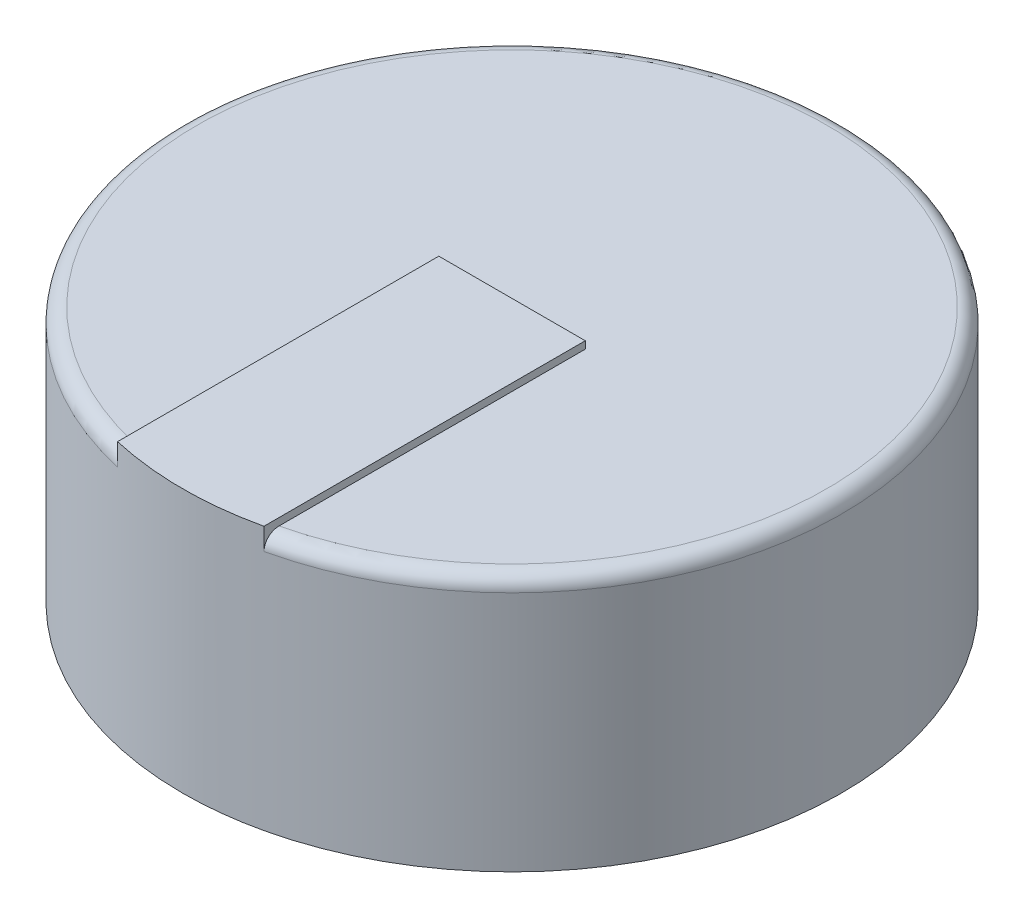
ISO-10303-21;
HEADER;
FILE_DESCRIPTION(('STEP AP214'),'2;1');
FILE_NAME('part.step','',(''),(''),'','','');
FILE_SCHEMA(('AUTOMOTIVE_DESIGN { 1 0 10303 214 1 1 1 1 }'));
ENDSEC;
DATA;
#1=APPLICATION_CONTEXT('core data for automotive mechanical design processes');
#2=APPLICATION_PROTOCOL_DEFINITION('international standard','automotive_design',2000,#1);
#3=PRODUCT_CONTEXT('',#1,'mechanical');
#4=PRODUCT('Part','Part','',(#3));
#5=PRODUCT_RELATED_PRODUCT_CATEGORY('part','',(#4));
#6=PRODUCT_DEFINITION_FORMATION('','',#4);
#7=PRODUCT_DEFINITION_CONTEXT('part definition',#1,'design');
#8=PRODUCT_DEFINITION('design','',#6,#7);
#9=PRODUCT_DEFINITION_SHAPE('','',#8);
#10=(LENGTH_UNIT() NAMED_UNIT(*) SI_UNIT(.MILLI.,.METRE.));
#11=(NAMED_UNIT(*) PLANE_ANGLE_UNIT() SI_UNIT($,.RADIAN.));
#12=(NAMED_UNIT(*) SI_UNIT($,.STERADIAN.) SOLID_ANGLE_UNIT());
#13=UNCERTAINTY_MEASURE_WITH_UNIT(LENGTH_MEASURE(1.E-05),#10,'distance_accuracy_value','');
#14=(GEOMETRIC_REPRESENTATION_CONTEXT(3) GLOBAL_UNCERTAINTY_ASSIGNED_CONTEXT((#13)) GLOBAL_UNIT_ASSIGNED_CONTEXT((#10,
#11,#12)) REPRESENTATION_CONTEXT('',''));
#15=CARTESIAN_POINT('',(0.,0.,0.));
#16=DIRECTION('',(0.,0.,1.));
#17=DIRECTION('',(1.,0.,0.));
#18=AXIS2_PLACEMENT_3D('',#15,#16,#17);
#19=CARTESIAN_POINT('',(0.,4.445,0.));
#20=DIRECTION('',(0.,-1.,0.));
#21=DIRECTION('',(0.,0.,-1.));
#22=AXIS2_PLACEMENT_3D('',#19,#20,#21);
#23=CYLINDRICAL_SURFACE('',#22,5.715);
#24=CARTESIAN_POINT('',(0.,0.,0.));
#25=DIRECTION('',(0.,1.,0.));
#26=DIRECTION('',(0.,0.,1.));
#27=AXIS2_PLACEMENT_3D('',#24,#25,#26);
#28=CIRCLE('',#27,5.715);
#29=CARTESIAN_POINT('',(0.,0.,5.715));
#30=VERTEX_POINT('',#29);
#31=EDGE_CURVE('E123',#30,#30,#28,.T.);
#32=ORIENTED_EDGE('',*,*,#31,.T.);
#33=EDGE_LOOP('',(#32));
#34=FACE_BOUND('',#33,.T.);
#35=CARTESIAN_POINT('',(0.,4.191,0.));
#36=DIRECTION('',(0.,1.,0.));
#37=DIRECTION('',(0.,0.,1.));
#38=AXIS2_PLACEMENT_3D('',#35,#36,#37);
#39=CIRCLE('',#38,5.715);
#40=CARTESIAN_POINT('',(-1.27,4.19099999999924,5.5721023859994));
#41=VERTEX_POINT('',#40);
#42=CARTESIAN_POINT('',(1.27,4.191,5.572102385994));
#43=VERTEX_POINT('',#42);
#44=EDGE_CURVE('E128',#41,#43,#39,.F.);
#45=ORIENTED_EDGE('',*,*,#44,.T.);
#46=DIRECTION('',(0.,-1.,0.));
#47=VECTOR('',#46,1.);
#48=CARTESIAN_POINT('',(1.27,4.572,5.572102385994));
#49=LINE('',#48,#47);
#50=CARTESIAN_POINT('',(1.27,4.572,5.572102385994));
#51=VERTEX_POINT('',#50);
#52=EDGE_CURVE('E93',#51,#43,#49,.T.);
#53=ORIENTED_EDGE('',*,*,#52,.F.);
#54=CARTESIAN_POINT('',(0.,4.572,0.));
#55=DIRECTION('',(0.,-1.,0.));
#56=DIRECTION('',(0.,0.,1.));
#57=AXIS2_PLACEMENT_3D('',#54,#55,#56);
#58=CIRCLE('',#57,5.715);
#59=CARTESIAN_POINT('',(-1.27,4.572,5.572102385994));
#60=VERTEX_POINT('',#59);
#61=EDGE_CURVE('E104',#51,#60,#58,.T.);
#62=ORIENTED_EDGE('',*,*,#61,.T.);
#63=DIRECTION('',(0.,-1.,0.));
#64=VECTOR('',#63,1.);
#65=CARTESIAN_POINT('',(-1.27,4.572,5.572102385994));
#66=LINE('',#65,#64);
#67=EDGE_CURVE('E115',#60,#41,#66,.T.);
#68=ORIENTED_EDGE('',*,*,#67,.T.);
#69=EDGE_LOOP('',(#45,#53,#62,#68));
#70=FACE_BOUND('',#69,.T.);
#71=ADVANCED_FACE('F35',(#34,#70),#23,.T.);
#72=CARTESIAN_POINT('',(0.,4.445,0.));
#73=DIRECTION('',(0.,1.,0.));
#74=DIRECTION('',(0.,0.,1.));
#75=AXIS2_PLACEMENT_3D('',#72,#73,#74);
#76=PLANE('',#75);
#77=DIRECTION('',(0.,0.,1.));
#78=VECTOR('',#77,1.);
#79=CARTESIAN_POINT('',(1.27,4.445,5.715));
#80=LINE('',#79,#78);
#81=CARTESIAN_POINT('',(1.27,4.445,0.));
#82=VERTEX_POINT('',#81);
#83=CARTESIAN_POINT('',(1.27,4.445,5.31127301124693));
#84=VERTEX_POINT('',#83);
#85=EDGE_CURVE('E89',#82,#84,#80,.T.);
#86=ORIENTED_EDGE('',*,*,#85,.T.);
#87=CARTESIAN_POINT('',(0.,4.445,0.));
#88=DIRECTION('',(0.,1.,0.));
#89=DIRECTION('',(0.,0.,1.));
#90=AXIS2_PLACEMENT_3D('',#87,#88,#89);
#91=CIRCLE('',#90,5.461);
#92=CARTESIAN_POINT('',(-1.27,4.445,5.31127301124693));
#93=VERTEX_POINT('',#92);
#94=EDGE_CURVE('E126',#84,#93,#91,.T.);
#95=ORIENTED_EDGE('',*,*,#94,.T.);
#96=DIRECTION('',(0.,0.,-1.));
#97=VECTOR('',#96,1.);
#98=CARTESIAN_POINT('',(-1.27,4.445,0.));
#99=LINE('',#98,#97);
#100=CARTESIAN_POINT('',(-1.27,4.445,0.));
#101=VERTEX_POINT('',#100);
#102=EDGE_CURVE('E114',#93,#101,#99,.T.);
#103=ORIENTED_EDGE('',*,*,#102,.T.);
#104=DIRECTION('',(1.,0.,0.));
#105=VECTOR('',#104,1.);
#106=CARTESIAN_POINT('',(1.27,4.445,0.));
#107=LINE('',#106,#105);
#108=EDGE_CURVE('E120',#101,#82,#107,.T.);
#109=ORIENTED_EDGE('',*,*,#108,.T.);
#110=EDGE_LOOP('',(#86,#95,#103,#109));
#111=FACE_BOUND('',#110,.T.);
#112=ADVANCED_FACE('F136',(#111),#76,.T.);
#113=CARTESIAN_POINT('',(0.,0.,0.));
#114=DIRECTION('',(0.,1.,0.));
#115=DIRECTION('',(0.,0.,1.));
#116=AXIS2_PLACEMENT_3D('',#113,#114,#115);
#117=PLANE('',#116);
#118=ORIENTED_EDGE('',*,*,#31,.F.);
#119=EDGE_LOOP('',(#118));
#120=FACE_BOUND('',#119,.T.);
#121=ADVANCED_FACE('F139',(#120),#117,.F.);
#122=CARTESIAN_POINT('',(0.,4.191,0.));
#123=DIRECTION('',(0.,1.,0.));
#124=DIRECTION('',(0.,0.,1.));
#125=AXIS2_PLACEMENT_3D('',#122,#123,#124);
#126=TOROIDAL_SURFACE('',#125,5.461,0.254);
#127=CARTESIAN_POINT('',(1.27,4.32026832968139,5.08619547771289));
#128=CARTESIAN_POINT('',(1.27,4.3083429714675,5.07892910262781));
#129=CARTESIAN_POINT('',(1.27,4.29580631370099,5.07264950372764));
#130=CARTESIAN_POINT('',(1.27,4.26985002626806,5.06227218953751));
#131=CARTESIAN_POINT('',(1.27,4.256429621953,5.05817641787207));
#132=CARTESIAN_POINT('',(1.27,4.22908515977283,5.05230835180071));
#133=CARTESIAN_POINT('',(1.27,4.21516099292922,5.05053656326584));
#134=CARTESIAN_POINT('',(1.27,4.18721679037792,5.04937988700542));
#135=CARTESIAN_POINT('',(1.27,4.17319677564562,5.04999449274146));
#136=CARTESIAN_POINT('',(1.27,4.14558294220099,5.05357247698199));
#137=CARTESIAN_POINT('',(1.27,4.13198649991795,5.05651567159612));
#138=CARTESIAN_POINT('',(1.27,4.10547529420661,5.06462781958715));
#139=CARTESIAN_POINT('',(1.27,4.0925605584863,5.0697968633557));
#140=CARTESIAN_POINT('',(1.27,4.06767578258765,5.08223757339364));
#141=CARTESIAN_POINT('',(1.27,4.0557129363703,5.08952361136342));
#142=CARTESIAN_POINT('',(1.27,4.03314375146116,5.10595721463734));
#143=CARTESIAN_POINT('',(1.27,4.02253755046791,5.1151049686606));
#144=CARTESIAN_POINT('',(1.27,4.0027129417968,5.13522671261735));
#145=CARTESIAN_POINT('',(1.27,3.99353291634412,5.14623850192753));
#146=CARTESIAN_POINT('',(1.27,3.97709022131763,5.16961044313599));
#147=CARTESIAN_POINT('',(1.27,3.96982782719107,5.18197078837997));
#148=CARTESIAN_POINT('',(1.27,3.95720982681494,5.20806953895184));
#149=CARTESIAN_POINT('',(1.27,3.9519149661967,5.22183732468778));
#150=CARTESIAN_POINT('',(1.27,3.94365742212271,5.25005558528616));
#151=CARTESIAN_POINT('',(1.27,3.94069503795445,5.26450614750574));
#152=CARTESIAN_POINT('',(1.27,3.93713545592233,5.29400688332369));
#153=CARTESIAN_POINT('',(1.27,3.93658959840715,5.3090632746806));
#154=CARTESIAN_POINT('',(1.27,3.93801975398172,5.33905660181313));
#155=CARTESIAN_POINT('',(1.27,3.93999590471316,5.35399353102418));
#156=CARTESIAN_POINT('',(1.27,3.94644237521773,5.38339433980218));
#157=CARTESIAN_POINT('',(1.27,3.95092440607716,5.39785565811085));
#158=CARTESIAN_POINT('',(1.27,3.96228394947428,5.42580582226911));
#159=CARTESIAN_POINT('',(1.27,3.96916134764747,5.43929471450916));
#160=CARTESIAN_POINT('',(1.27,3.98503232205843,5.46472202587595));
#161=CARTESIAN_POINT('',(1.27,3.9939972715722,5.47667829754332));
#162=CARTESIAN_POINT('',(1.27,4.01385288428507,5.498868749888));
#163=CARTESIAN_POINT('',(1.27,4.02474329516815,5.50910315585926));
#164=CARTESIAN_POINT('',(1.27,4.04786013550576,5.52729238028718));
#165=CARTESIAN_POINT('',(1.27,4.06004790688511,5.53529632181136));
#166=CARTESIAN_POINT('',(1.27,4.08562066292296,5.54908411436903));
#167=CARTESIAN_POINT('',(1.27,4.09900546788849,5.55486829793453));
#168=CARTESIAN_POINT('',(1.27,4.12623801351551,5.56390888459061));
#169=CARTESIAN_POINT('',(1.27,4.14006633330619,5.56722383599942));
#170=CARTESIAN_POINT('',(1.27,4.16808545259116,5.57144614021484));
#171=CARTESIAN_POINT('',(1.27,4.18227621472696,5.57235374015439));
#172=CARTESIAN_POINT('',(1.27,4.21039335308432,5.57173614211704));
#173=CARTESIAN_POINT('',(1.27,4.22432053202453,5.57024677928591));
#174=CARTESIAN_POINT('',(1.27,4.25172651450969,5.56495115305565));
#175=CARTESIAN_POINT('',(1.27,4.2652053274685,5.56114493833332));
#176=CARTESIAN_POINT('',(1.27,4.29134290150385,5.55133560772454));
#177=CARTESIAN_POINT('',(1.27,4.30400135528941,5.54533167414905));
#178=CARTESIAN_POINT('',(1.27,4.32815078072914,5.53131408445774));
#179=CARTESIAN_POINT('',(1.27,4.3396416856639,5.52330031358073));
#180=CARTESIAN_POINT('',(1.27,4.36132051134307,5.50536878259243));
#181=CARTESIAN_POINT('',(1.27,4.3714862108571,5.49542417391064));
#182=CARTESIAN_POINT('',(1.27,4.39005139785206,5.47400490241092));
#183=CARTESIAN_POINT('',(1.27,4.39845068222715,5.46253006389178));
#184=CARTESIAN_POINT('',(1.27,4.41346083158127,5.438082301901));
#185=CARTESIAN_POINT('',(1.27,4.42002380014525,5.4250799750148));
#186=CARTESIAN_POINT('',(1.27,4.43093228834578,5.3981764048075));
#187=CARTESIAN_POINT('',(1.27,4.43527751561357,5.38427504323711));
#188=CARTESIAN_POINT('',(1.27,4.44173012193407,5.3556102191358));
#189=CARTESIAN_POINT('',(1.27,4.44378118031801,5.34083406467704));
#190=CARTESIAN_POINT('',(1.27,4.44541145218846,5.31114607099004));
#191=CARTESIAN_POINT('',(1.27,4.44499050974829,5.29623422326189));
#192=CARTESIAN_POINT('',(1.27,4.44166636363201,5.26647749828477));
#193=CARTESIAN_POINT('',(1.27,4.43872852444374,5.25163647474998));
#194=CARTESIAN_POINT('',(1.27,4.43039511714687,5.22265583614796));
#195=CARTESIAN_POINT('',(1.27,4.42499890575732,5.20851640574077));
#196=CARTESIAN_POINT('',(1.27,4.41190063622754,5.18139416763901));
#197=CARTESIAN_POINT('',(1.27,4.40420454719642,5.16840847735717));
#198=CARTESIAN_POINT('',(1.27,4.38670324658917,5.14396101138999));
#199=CARTESIAN_POINT('',(1.27,4.37690078207446,5.13249728202384));
#200=CARTESIAN_POINT('',(1.27,4.35924251490909,5.11516680449076));
#201=CARTESIAN_POINT('',(1.27,4.35191731518367,5.1087509520296));
#202=CARTESIAN_POINT('',(1.27,4.33658301575257,5.09679568969986));
#203=CARTESIAN_POINT('',(1.27,4.3285739325614,5.09125625867657));
#204=CARTESIAN_POINT('',(1.27,4.32026832968139,5.08619547771289));
#205=B_SPLINE_CURVE_WITH_KNOTS('',3,(#127,#128,#129,#130,#131,#132,#133,#134,#135,#136,#137,
#138,#139,#140,#141,#142,#143,#144,#145,#146,#147,#148,#149,#150,#151,#152,#153,#154,#155,#156,
#157,#158,#159,#160,#161,#162,#163,#164,#165,#166,#167,#168,#169,#170,#171,#172,#173,#174,#175,
#176,#177,#178,#179,#180,#181,#182,#183,#184,#185,#186,#187,#188,#189,#190,#191,#192,#193,#194,
#195,#196,#197,#198,#199,#200,#201,#202,#203,#204),.UNSPECIFIED.,.T.,.F.,(4,2,2,2,2,2,2,2,2,2,2,
2,2,2,2,2,2,2,2,2,2,2,2,2,2,2,2,2,2,2,2,2,2,2,2,2,2,2,4),(0.,0.0418596956163892,
0.0837565847862871,0.125662592313295,0.167559705316084,0.209097586596755,0.250637154888495,
0.292465589925958,0.334298267157509,0.377112055925174,0.419931991094669,0.463981574433673,
0.508036808994365,0.553023661711224,0.598012969745669,0.643214311709059,0.688413495873417,
0.733025994116156,0.777632650581596,0.821161057602925,0.864682941280315,0.907136800108111,
0.949586300555802,0.991407044891878,1.03322691060916,1.07506235177723,1.11690018228238,
1.15936789033354,1.201840478738,1.24533505130447,1.28883535635715,1.3333816149206,
1.37793068336381,1.42310283214233,1.46828680788838,1.5133545167315,1.55836380274976,
1.58751834852021,1.61667219046208),.UNSPECIFIED.);
#206=EDGE_CURVE('E11',#43,#84,#205,.T.);
#207=ORIENTED_EDGE('',*,*,#206,.F.);
#208=ORIENTED_EDGE('',*,*,#44,.F.);
#209=CARTESIAN_POINT('',(-1.27,4.32026832968139,5.08619547771289));
#210=CARTESIAN_POINT('',(-1.27,4.33265412459833,5.09374394831758));
#211=CARTESIAN_POINT('',(-1.27,4.34439868626591,5.10236852246345));
#212=CARTESIAN_POINT('',(-1.27,4.36627074717549,5.12148790356731));
#213=CARTESIAN_POINT('',(-1.27,4.37639570836672,5.13198559244258));
#214=CARTESIAN_POINT('',(-1.27,4.39473826986234,5.15450243473056));
#215=CARTESIAN_POINT('',(-1.27,4.40295909568392,5.16651896111747));
#216=CARTESIAN_POINT('',(-1.27,4.41731237033628,5.19173383676542));
#217=CARTESIAN_POINT('',(-1.27,4.42344535272502,5.20493188299314));
#218=CARTESIAN_POINT('',(-1.27,4.43358961749471,5.23243436128011));
#219=CARTESIAN_POINT('',(-1.27,4.43755380937322,5.24675616762009));
#220=CARTESIAN_POINT('',(-1.27,4.44306696228353,5.27585855477401));
#221=CARTESIAN_POINT('',(-1.27,4.44461553882512,5.29063920824025));
#222=CARTESIAN_POINT('',(-1.27,4.44526351130186,5.3205065844209));
#223=CARTESIAN_POINT('',(-1.27,4.44432084109687,5.33559424007482));
#224=CARTESIAN_POINT('',(-1.27,4.43991488604224,5.36539782872617));
#225=CARTESIAN_POINT('',(-1.27,4.43645153977716,5.38011375265743));
#226=CARTESIAN_POINT('',(-1.27,4.42708807526705,5.40873794956975));
#227=CARTESIAN_POINT('',(-1.27,4.42118979257731,5.42264682195047));
#228=CARTESIAN_POINT('',(-1.27,4.40710223162839,5.44925257096447));
#229=CARTESIAN_POINT('',(-1.27,4.398913135674,5.4619495439339));
#230=CARTESIAN_POINT('',(-1.27,4.38061920656307,5.48552980402144));
#231=CARTESIAN_POINT('',(-1.27,4.37054983627369,5.49644058633028));
#232=CARTESIAN_POINT('',(-1.27,4.34867965925797,5.51636229251087));
#233=CARTESIAN_POINT('',(-1.27,4.33687909996071,5.52537348743216));
#234=CARTESIAN_POINT('',(-1.27,4.31220414755335,5.54099535429591));
#235=CARTESIAN_POINT('',(-1.27,4.29936476141233,5.54766132314395));
#236=CARTESIAN_POINT('',(-1.27,4.27273082399014,5.55868574612255));
#237=CARTESIAN_POINT('',(-1.27,4.25893640887217,5.56304452843708));
#238=CARTESIAN_POINT('',(-1.27,4.23111940849916,5.56923670297006));
#239=CARTESIAN_POINT('',(-1.27,4.21710899670124,5.57112486386536));
#240=CARTESIAN_POINT('',(-1.27,4.18897148348559,5.57249420376756));
#241=CARTESIAN_POINT('',(-1.27,4.17484439151463,5.57197557576464));
#242=CARTESIAN_POINT('',(-1.27,4.14703281974866,5.56856725445914));
#243=CARTESIAN_POINT('',(-1.27,4.13334523041434,5.56570283908614));
#244=CARTESIAN_POINT('',(-1.27,4.10664169624354,5.55772769035706));
#245=CARTESIAN_POINT('',(-1.27,4.09362575372364,5.5526169492537));
#246=CARTESIAN_POINT('',(-1.27,4.0685589788329,5.54027871342869));
#247=CARTESIAN_POINT('',(-1.27,4.05651331233219,5.53304073457276));
#248=CARTESIAN_POINT('',(-1.27,4.03377948213862,5.51667982802559));
#249=CARTESIAN_POINT('',(-1.27,4.02309142396231,5.50755675396483));
#250=CARTESIAN_POINT('',(-1.27,4.00316028151478,5.48750953498485));
#251=CARTESIAN_POINT('',(-1.27,3.99394757515262,5.47655520224645));
#252=CARTESIAN_POINT('',(-1.27,3.97743847974123,5.45328751751317));
#253=CARTESIAN_POINT('',(-1.27,3.9701423253927,5.4409739993346));
#254=CARTESIAN_POINT('',(-1.27,3.95748001910767,5.41500756259269));
#255=CARTESIAN_POINT('',(-1.27,3.95216687747174,5.40132879195945));
#256=CARTESIAN_POINT('',(-1.27,3.94385643523735,5.37328498354292));
#257=CARTESIAN_POINT('',(-1.27,3.94085942908952,5.35891985874975));
#258=CARTESIAN_POINT('',(-1.27,3.93720696751516,5.32957195572113));
#259=CARTESIAN_POINT('',(-1.27,3.93660468286661,5.31458254313092));
#260=CARTESIAN_POINT('',(-1.27,3.93789887575707,5.28471130685243));
#261=CARTESIAN_POINT('',(-1.27,3.93979555359714,5.26982949188462));
#262=CARTESIAN_POINT('',(-1.27,3.94607091590164,5.24044858274876));
#263=CARTESIAN_POINT('',(-1.27,3.95047314225697,5.22595450401657));
#264=CARTESIAN_POINT('',(-1.27,3.96166866666411,5.19791991731402));
#265=CARTESIAN_POINT('',(-1.27,3.96846193554538,5.18437939771274));
#266=CARTESIAN_POINT('',(-1.27,3.9841996673643,5.158770688183));
#267=CARTESIAN_POINT('',(-1.27,3.99312518675889,5.14669087001536));
#268=CARTESIAN_POINT('',(-1.27,4.01292419407552,5.12424839773873));
#269=CARTESIAN_POINT('',(-1.27,4.02379743609335,5.1138855271789));
#270=CARTESIAN_POINT('',(-1.27,4.04690399256515,5.09544831103828));
#271=CARTESIAN_POINT('',(-1.27,4.05909767983378,5.087324325338));
#272=CARTESIAN_POINT('',(-1.27,4.08470759233714,5.07331128570546));
#273=CARTESIAN_POINT('',(-1.27,4.0981235434409,5.06742173215459));
#274=CARTESIAN_POINT('',(-1.27,4.12537447985249,5.05822089889044));
#275=CARTESIAN_POINT('',(-1.27,4.13918571586947,5.05483921691643));
#276=CARTESIAN_POINT('',(-1.27,4.16718709105077,5.05049275082818));
#277=CARTESIAN_POINT('',(-1.27,4.18137727978716,5.04952828449862));
#278=CARTESIAN_POINT('',(-1.27,4.2094441388687,5.05004547128112));
#279=CARTESIAN_POINT('',(-1.27,4.22332170050719,5.05148161594807));
#280=CARTESIAN_POINT('',(-1.27,4.2506251973841,5.05666466843896));
#281=CARTESIAN_POINT('',(-1.27,4.264051693492,5.06040858538968));
#282=CARTESIAN_POINT('',(-1.27,4.28457961696276,5.06802899279242));
#283=CARTESIAN_POINT('',(-1.27,4.29195794928914,5.07118199705873));
#284=CARTESIAN_POINT('',(-1.27,4.30637893998766,5.0781788955533));
#285=CARTESIAN_POINT('',(-1.27,4.31342160722725,5.0820227715176));
#286=CARTESIAN_POINT('',(-1.27,4.32026832968139,5.08619547771289));
#287=B_SPLINE_CURVE_WITH_KNOTS('',3,(#209,#210,#211,#212,#213,#214,#215,#216,#217,#218,#219,
#220,#221,#222,#223,#224,#225,#226,#227,#228,#229,#230,#231,#232,#233,#234,#235,#236,#237,#238,
#239,#240,#241,#242,#243,#244,#245,#246,#247,#248,#249,#250,#251,#252,#253,#254,#255,#256,#257,
#258,#259,#260,#261,#262,#263,#264,#265,#266,#267,#268,#269,#270,#271,#272,#273,#274,#275,#276,
#277,#278,#279,#280,#281,#282,#283,#284,#285,#286),.UNSPECIFIED.,.T.,.F.,(4,2,2,2,2,2,2,2,2,2,2,
2,2,2,2,2,2,2,2,2,2,2,2,2,2,2,2,2,2,2,2,2,2,2,2,2,2,2,4),(0.,0.043483894266563,
0.0870352776596562,0.130512338496986,0.173978280216676,0.218353903367395,0.262736589005165,
0.307873470400084,0.353011451577476,0.398115467843012,0.44321589571455,0.487538759086421,
0.531855293802077,0.575043055887636,0.618224673111059,0.660431847988145,0.702635638509932,
0.744390538716862,0.786145582932021,0.82810997110356,0.870077618854049,0.912821392248277,
0.955570397601762,0.999391855446519,1.04321888340336,1.08801375773269,1.13281222275463,
1.17803872759503,1.22326468069455,1.26810287029295,1.31293540295714,1.35667478248157,
1.40040437611648,1.44285435774668,1.4853099198667,1.52696974363139,1.56857568944622,
1.59261371259515,1.61665110036597),.UNSPECIFIED.);
#288=EDGE_CURVE('E47',#93,#41,#287,.T.);
#289=ORIENTED_EDGE('',*,*,#288,.F.);
#290=ORIENTED_EDGE('',*,*,#94,.F.);
#291=EDGE_LOOP('',(#207,#208,#289,#290));
#292=FACE_BOUND('',#291,.T.);
#293=ADVANCED_FACE('F37',(#292),#126,.T.);
#294=CARTESIAN_POINT('',(-1.27,4.572,0.));
#295=DIRECTION('',(0.,0.,-1.));
#296=DIRECTION('',(-1.,0.,0.));
#297=AXIS2_PLACEMENT_3D('',#294,#295,#296);
#298=PLANE('',#297);
#299=DIRECTION('',(0.,-1.,0.));
#300=VECTOR('',#299,1.);
#301=CARTESIAN_POINT('',(1.27,4.572,0.));
#302=LINE('',#301,#300);
#303=CARTESIAN_POINT('',(1.27,4.572,0.));
#304=VERTEX_POINT('',#303);
#305=EDGE_CURVE('E84',#304,#82,#302,.T.);
#306=ORIENTED_EDGE('',*,*,#305,.T.);
#307=ORIENTED_EDGE('',*,*,#108,.F.);
#308=DIRECTION('',(0.,-1.,0.));
#309=VECTOR('',#308,1.);
#310=CARTESIAN_POINT('',(-1.27,4.572,0.));
#311=LINE('',#310,#309);
#312=CARTESIAN_POINT('',(-1.27,4.572,0.));
#313=VERTEX_POINT('',#312);
#314=EDGE_CURVE('E108',#313,#101,#311,.T.);
#315=ORIENTED_EDGE('',*,*,#314,.F.);
#316=DIRECTION('',(1.,0.,0.));
#317=VECTOR('',#316,1.);
#318=CARTESIAN_POINT('',(-1.27,4.572,0.));
#319=LINE('',#318,#317);
#320=EDGE_CURVE('E101',#313,#304,#319,.T.);
#321=ORIENTED_EDGE('',*,*,#320,.T.);
#322=EDGE_LOOP('',(#306,#307,#315,#321));
#323=FACE_BOUND('',#322,.T.);
#324=ADVANCED_FACE('F106',(#323),#298,.T.);
#325=CARTESIAN_POINT('',(-1.27,4.572,0.));
#326=DIRECTION('',(-1.,0.,0.));
#327=DIRECTION('',(0.,0.,1.));
#328=AXIS2_PLACEMENT_3D('',#325,#326,#327);
#329=PLANE('',#328);
#330=ORIENTED_EDGE('',*,*,#314,.T.);
#331=ORIENTED_EDGE('',*,*,#102,.F.);
#332=ORIENTED_EDGE('',*,*,#288,.T.);
#333=ORIENTED_EDGE('',*,*,#67,.F.);
#334=DIRECTION('',(0.,0.,-1.));
#335=VECTOR('',#334,1.);
#336=CARTESIAN_POINT('',(-1.27,4.572,0.));
#337=LINE('',#336,#335);
#338=EDGE_CURVE('E94',#60,#313,#337,.T.);
#339=ORIENTED_EDGE('',*,*,#338,.T.);
#340=EDGE_LOOP('',(#330,#331,#332,#333,#339));
#341=FACE_BOUND('',#340,.T.);
#342=ADVANCED_FACE('F151',(#341),#329,.T.);
#343=CARTESIAN_POINT('',(1.27,4.572,0.));
#344=DIRECTION('',(1.,0.,0.));
#345=DIRECTION('',(0.,0.,-1.));
#346=AXIS2_PLACEMENT_3D('',#343,#344,#345);
#347=PLANE('',#346);
#348=ORIENTED_EDGE('',*,*,#206,.T.);
#349=ORIENTED_EDGE('',*,*,#85,.F.);
#350=ORIENTED_EDGE('',*,*,#305,.F.);
#351=DIRECTION('',(0.,0.,1.));
#352=VECTOR('',#351,1.);
#353=CARTESIAN_POINT('',(1.27,4.572,0.));
#354=LINE('',#353,#352);
#355=EDGE_CURVE('E88',#304,#51,#354,.T.);
#356=ORIENTED_EDGE('',*,*,#355,.T.);
#357=ORIENTED_EDGE('',*,*,#52,.T.);
#358=EDGE_LOOP('',(#348,#349,#350,#356,#357));
#359=FACE_BOUND('',#358,.T.);
#360=ADVANCED_FACE('F86',(#359),#347,.T.);
#361=CARTESIAN_POINT('',(0.,4.572,0.));
#362=DIRECTION('',(0.,1.,0.));
#363=DIRECTION('',(0.,0.,1.));
#364=AXIS2_PLACEMENT_3D('',#361,#362,#363);
#365=PLANE('',#364);
#366=ORIENTED_EDGE('',*,*,#320,.F.);
#367=ORIENTED_EDGE('',*,*,#338,.F.);
#368=ORIENTED_EDGE('',*,*,#61,.F.);
#369=ORIENTED_EDGE('',*,*,#355,.F.);
#370=EDGE_LOOP('',(#366,#367,#368,#369));
#371=FACE_BOUND('',#370,.T.);
#372=ADVANCED_FACE('F99',(#371),#365,.T.);
#373=CLOSED_SHELL('',(#71,#112,#121,#293,#324,#342,#360,#372));
#374=MANIFOLD_SOLID_BREP('B2',#373);
#375=ADVANCED_BREP_SHAPE_REPRESENTATION('',(#18,#374),#14);
#376=SHAPE_DEFINITION_REPRESENTATION(#9,#375);
ENDSEC;
END-ISO-10303-21;
